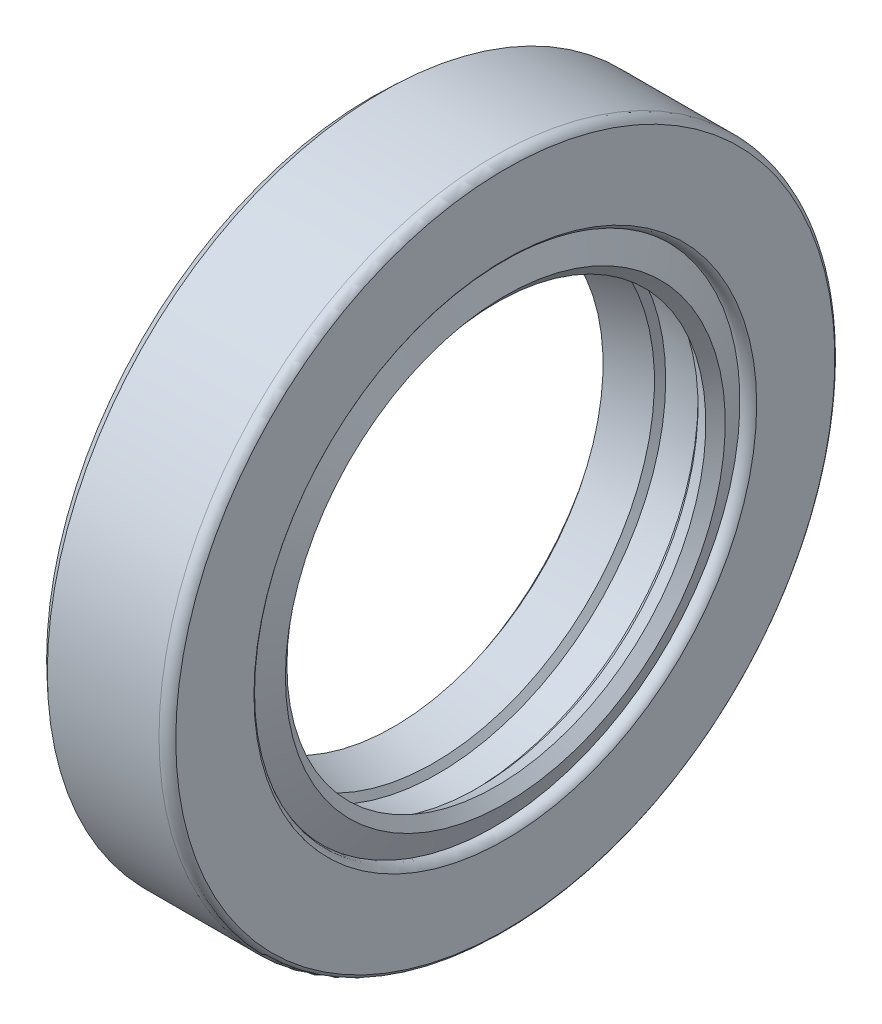
ISO-10303-21;
HEADER;
FILE_DESCRIPTION(('STEP AP214'),'2;1');
FILE_NAME('part.step','',(''),(''),'','','');
FILE_SCHEMA(('AUTOMOTIVE_DESIGN { 1 0 10303 214 1 1 1 1 }'));
ENDSEC;
DATA;
#1=APPLICATION_CONTEXT('core data for automotive mechanical design processes');
#2=APPLICATION_PROTOCOL_DEFINITION('international standard','automotive_design',2000,#1);
#3=PRODUCT_CONTEXT('',#1,'mechanical');
#4=PRODUCT('Part','Part','',(#3));
#5=PRODUCT_RELATED_PRODUCT_CATEGORY('part','',(#4));
#6=PRODUCT_DEFINITION_FORMATION('','',#4);
#7=PRODUCT_DEFINITION_CONTEXT('part definition',#1,'design');
#8=PRODUCT_DEFINITION('design','',#6,#7);
#9=PRODUCT_DEFINITION_SHAPE('','',#8);
#10=(LENGTH_UNIT() NAMED_UNIT(*) SI_UNIT(.MILLI.,.METRE.));
#11=(NAMED_UNIT(*) PLANE_ANGLE_UNIT() SI_UNIT($,.RADIAN.));
#12=(NAMED_UNIT(*) SI_UNIT($,.STERADIAN.) SOLID_ANGLE_UNIT());
#13=UNCERTAINTY_MEASURE_WITH_UNIT(LENGTH_MEASURE(1.E-05),#10,'distance_accuracy_value','');
#14=(GEOMETRIC_REPRESENTATION_CONTEXT(3) GLOBAL_UNCERTAINTY_ASSIGNED_CONTEXT((#13)) GLOBAL_UNIT_ASSIGNED_CONTEXT((#10,
#11,#12)) REPRESENTATION_CONTEXT('',''));
#15=CARTESIAN_POINT('',(0.,0.,0.));
#16=DIRECTION('',(0.,0.,1.));
#17=DIRECTION('',(1.,0.,0.));
#18=AXIS2_PLACEMENT_3D('',#15,#16,#17);
#19=CARTESIAN_POINT('',(0.,0.,0.));
#20=DIRECTION('',(-1.,0.,0.));
#21=DIRECTION('',(0.,0.,1.));
#22=AXIS2_PLACEMENT_3D('',#19,#20,#21);
#23=CYLINDRICAL_SURFACE('',#22,20.);
#24=CARTESIAN_POINT('',(7.33333333333333,0.,0.));
#25=DIRECTION('',(-1.,0.,0.));
#26=DIRECTION('',(0.,0.,1.));
#27=AXIS2_PLACEMENT_3D('',#24,#25,#26);
#28=CIRCLE('',#27,20.);
#29=CARTESIAN_POINT('',(7.33333333333333,0.,20.));
#30=VERTEX_POINT('',#29);
#31=EDGE_CURVE('E9',#30,#30,#28,.T.);
#32=ORIENTED_EDGE('',*,*,#31,.T.);
#33=EDGE_LOOP('',(#32));
#34=FACE_BOUND('',#33,.T.);
#35=CARTESIAN_POINT('',(0.666666666666667,0.,0.));
#36=DIRECTION('',(-1.,0.,0.));
#37=DIRECTION('',(0.,0.,1.));
#38=AXIS2_PLACEMENT_3D('',#35,#36,#37);
#39=CIRCLE('',#38,20.);
#40=CARTESIAN_POINT('',(0.666666666666667,0.,20.));
#41=VERTEX_POINT('',#40);
#42=EDGE_CURVE('E81',#41,#41,#39,.T.);
#43=ORIENTED_EDGE('',*,*,#42,.F.);
#44=EDGE_LOOP('',(#43));
#45=FACE_BOUND('',#44,.T.);
#46=ADVANCED_FACE('F14',(#34,#45),#23,.T.);
#47=CARTESIAN_POINT('',(7.41946005043015,0.,0.));
#48=DIRECTION('',(-1.,0.,0.));
#49=DIRECTION('',(0.,0.,1.));
#50=AXIS2_PLACEMENT_3D('',#47,#48,#49);
#51=TOROIDAL_SURFACE('',#50,19.3389201008603,0.666666666666667);
#52=ORIENTED_EDGE('',*,*,#31,.F.);
#53=EDGE_LOOP('',(#52));
#54=FACE_BOUND('',#53,.T.);
#55=CARTESIAN_POINT('',(8.,0.,0.));
#56=DIRECTION('',(-1.,0.,0.));
#57=DIRECTION('',(0.,0.,1.));
#58=AXIS2_PLACEMENT_3D('',#55,#56,#57);
#59=CIRCLE('',#58,19.6666666666666);
#60=CARTESIAN_POINT('',(8.,0.,19.6666666666666));
#61=VERTEX_POINT('',#60);
#62=EDGE_CURVE('E20',#61,#61,#59,.T.);
#63=ORIENTED_EDGE('',*,*,#62,.T.);
#64=EDGE_LOOP('',(#63));
#65=FACE_BOUND('',#64,.T.);
#66=ADVANCED_FACE('F89',(#54,#65),#51,.T.);
#67=CARTESIAN_POINT('',(8.,19.6666666666666,0.));
#68=DIRECTION('',(1.,0.,0.));
#69=DIRECTION('',(0.,0.,-1.));
#70=AXIS2_PLACEMENT_3D('',#67,#68,#69);
#71=PLANE('',#70);
#72=CARTESIAN_POINT('',(8.,0.,0.));
#73=DIRECTION('',(-1.,0.,0.));
#74=DIRECTION('',(0.,0.,1.));
#75=AXIS2_PLACEMENT_3D('',#72,#73,#74);
#76=CIRCLE('',#75,15.);
#77=CARTESIAN_POINT('',(8.,0.,15.));
#78=VERTEX_POINT('',#77);
#79=EDGE_CURVE('E24',#78,#78,#76,.T.);
#80=ORIENTED_EDGE('',*,*,#79,.T.);
#81=EDGE_LOOP('',(#80));
#82=FACE_BOUND('',#81,.T.);
#83=ORIENTED_EDGE('',*,*,#62,.F.);
#84=EDGE_LOOP('',(#83));
#85=FACE_BOUND('',#84,.T.);
#86=ADVANCED_FACE('F94',(#82,#85),#71,.T.);
#87=CARTESIAN_POINT('',(7.41946005043015,0.,0.));
#88=DIRECTION('',(-1.,0.,0.));
#89=DIRECTION('',(0.,0.,1.));
#90=AXIS2_PLACEMENT_3D('',#87,#88,#89);
#91=TOROIDAL_SURFACE('',#90,15.3277465658064,0.666666666666667);
#92=ORIENTED_EDGE('',*,*,#79,.F.);
#93=EDGE_LOOP('',(#92));
#94=FACE_BOUND('',#93,.T.);
#95=CARTESIAN_POINT('',(7.33333333333333,0.,0.));
#96=DIRECTION('',(-1.,0.,0.));
#97=DIRECTION('',(0.,0.,1.));
#98=AXIS2_PLACEMENT_3D('',#95,#96,#97);
#99=CIRCLE('',#98,14.6666666666667);
#100=CARTESIAN_POINT('',(7.33333333333333,0.,14.6666666666667));
#101=VERTEX_POINT('',#100);
#102=EDGE_CURVE('E28',#101,#101,#99,.T.);
#103=ORIENTED_EDGE('',*,*,#102,.T.);
#104=EDGE_LOOP('',(#103));
#105=FACE_BOUND('',#104,.T.);
#106=ADVANCED_FACE('F99',(#94,#105),#91,.T.);
#107=CARTESIAN_POINT('',(8.,0.,0.));
#108=DIRECTION('',(-1.,0.,0.));
#109=DIRECTION('',(0.,0.,1.));
#110=AXIS2_PLACEMENT_3D('',#107,#108,#109);
#111=CONICAL_SURFACE('',#110,13.125,1.16264722303981);
#112=ORIENTED_EDGE('',*,*,#102,.F.);
#113=EDGE_LOOP('',(#112));
#114=FACE_BOUND('',#113,.T.);
#115=CARTESIAN_POINT('',(8.,0.,0.));
#116=DIRECTION('',(-1.,0.,0.));
#117=DIRECTION('',(0.,0.,1.));
#118=AXIS2_PLACEMENT_3D('',#115,#116,#117);
#119=CIRCLE('',#118,13.125);
#120=CARTESIAN_POINT('',(8.,0.,13.125));
#121=VERTEX_POINT('',#120);
#122=EDGE_CURVE('E33',#121,#121,#119,.T.);
#123=ORIENTED_EDGE('',*,*,#122,.T.);
#124=EDGE_LOOP('',(#123));
#125=FACE_BOUND('',#124,.T.);
#126=ADVANCED_FACE('F105',(#114,#125),#111,.T.);
#127=CARTESIAN_POINT('',(7.46666666666667,0.,0.));
#128=DIRECTION('',(1.,0.,0.));
#129=DIRECTION('',(0.,0.,-1.));
#130=AXIS2_PLACEMENT_3D('',#127,#128,#129);
#131=CONICAL_SURFACE('',#130,12.5,0.86437027113884);
#132=ORIENTED_EDGE('',*,*,#122,.F.);
#133=EDGE_LOOP('',(#132));
#134=FACE_BOUND('',#133,.T.);
#135=CARTESIAN_POINT('',(7.46666666666667,0.,0.));
#136=DIRECTION('',(-1.,0.,0.));
#137=DIRECTION('',(0.,0.,1.));
#138=AXIS2_PLACEMENT_3D('',#135,#136,#137);
#139=CIRCLE('',#138,12.5);
#140=CARTESIAN_POINT('',(7.46666666666667,0.,12.5));
#141=VERTEX_POINT('',#140);
#142=EDGE_CURVE('E36',#141,#141,#139,.T.);
#143=ORIENTED_EDGE('',*,*,#142,.T.);
#144=EDGE_LOOP('',(#143));
#145=FACE_BOUND('',#144,.T.);
#146=ADVANCED_FACE('F109',(#134,#145),#131,.F.);
#147=CARTESIAN_POINT('',(6.33333333333333,0.,0.));
#148=DIRECTION('',(-1.,0.,0.));
#149=DIRECTION('',(0.,0.,1.));
#150=AXIS2_PLACEMENT_3D('',#147,#148,#149);
#151=CONICAL_SURFACE('',#150,13.1666666666667,0.531724067258805);
#152=ORIENTED_EDGE('',*,*,#142,.F.);
#153=EDGE_LOOP('',(#152));
#154=FACE_BOUND('',#153,.T.);
#155=CARTESIAN_POINT('',(6.33333333333333,0.,0.));
#156=DIRECTION('',(-1.,0.,0.));
#157=DIRECTION('',(0.,0.,1.));
#158=AXIS2_PLACEMENT_3D('',#155,#156,#157);
#159=CIRCLE('',#158,13.1666666666667);
#160=CARTESIAN_POINT('',(6.33333333333333,0.,13.1666666666667));
#161=VERTEX_POINT('',#160);
#162=EDGE_CURVE('E39',#161,#161,#159,.T.);
#163=ORIENTED_EDGE('',*,*,#162,.T.);
#164=EDGE_LOOP('',(#163));
#165=FACE_BOUND('',#164,.T.);
#166=ADVANCED_FACE('F113',(#154,#165),#151,.F.);
#167=CARTESIAN_POINT('',(5.72570811482257,0.,0.));
#168=DIRECTION('',(-1.,0.,0.));
#169=DIRECTION('',(0.,0.,1.));
#170=AXIS2_PLACEMENT_3D('',#167,#168,#169);
#171=TOROIDAL_SURFACE('',#170,12.8923747814892,0.666666666666667);
#172=CARTESIAN_POINT('',(6.,0.,0.));
#173=DIRECTION('',(-1.,0.,0.));
#174=DIRECTION('',(0.,0.,1.));
#175=AXIS2_PLACEMENT_3D('',#172,#173,#174);
#176=CIRCLE('',#175,13.5);
#177=CARTESIAN_POINT('',(6.,0.,13.5));
#178=VERTEX_POINT('',#177);
#179=EDGE_CURVE('E42',#178,#178,#176,.T.);
#180=ORIENTED_EDGE('',*,*,#179,.T.);
#181=EDGE_LOOP('',(#180));
#182=FACE_BOUND('',#181,.T.);
#183=ORIENTED_EDGE('',*,*,#162,.F.);
#184=EDGE_LOOP('',(#183));
#185=FACE_BOUND('',#184,.T.);
#186=ADVANCED_FACE('F117',(#182,#185),#171,.F.);
#187=CARTESIAN_POINT('',(4.,0.,0.));
#188=DIRECTION('',(-1.,0.,0.));
#189=DIRECTION('',(0.,0.,1.));
#190=AXIS2_PLACEMENT_3D('',#187,#188,#189);
#191=CONICAL_SURFACE('',#190,13.5714285714286,0.0356991126793238);
#192=ORIENTED_EDGE('',*,*,#179,.F.);
#193=EDGE_LOOP('',(#192));
#194=FACE_BOUND('',#193,.T.);
#195=CARTESIAN_POINT('',(4.,0.,0.));
#196=DIRECTION('',(-1.,0.,0.));
#197=DIRECTION('',(0.,0.,1.));
#198=AXIS2_PLACEMENT_3D('',#195,#196,#197);
#199=CIRCLE('',#198,13.5714285714286);
#200=CARTESIAN_POINT('',(4.,0.,13.5714285714286));
#201=VERTEX_POINT('',#200);
#202=EDGE_CURVE('E45',#201,#201,#199,.T.);
#203=ORIENTED_EDGE('',*,*,#202,.T.);
#204=EDGE_LOOP('',(#203));
#205=FACE_BOUND('',#204,.T.);
#206=ADVANCED_FACE('F121',(#194,#205),#191,.F.);
#207=CARTESIAN_POINT('',(4.,0.,0.));
#208=DIRECTION('',(1.,0.,0.));
#209=DIRECTION('',(0.,0.,-1.));
#210=AXIS2_PLACEMENT_3D('',#207,#208,#209);
#211=CONICAL_SURFACE('',#210,13.5714285714286,0.988243260581542);
#212=CARTESIAN_POINT('',(3.73333333333334,0.,0.));
#213=DIRECTION('',(-1.,0.,0.));
#214=DIRECTION('',(0.,0.,1.));
#215=AXIS2_PLACEMENT_3D('',#212,#213,#214);
#216=CIRCLE('',#215,13.1666666666667);
#217=CARTESIAN_POINT('',(3.73333333333334,0.,13.1666666666667));
#218=VERTEX_POINT('',#217);
#219=EDGE_CURVE('E48',#218,#218,#216,.T.);
#220=ORIENTED_EDGE('',*,*,#219,.T.);
#221=EDGE_LOOP('',(#220));
#222=FACE_BOUND('',#221,.T.);
#223=ORIENTED_EDGE('',*,*,#202,.F.);
#224=EDGE_LOOP('',(#223));
#225=FACE_BOUND('',#224,.T.);
#226=ADVANCED_FACE('F125',(#222,#225),#211,.F.);
#227=CARTESIAN_POINT('',(3.73333333333334,0.,0.));
#228=DIRECTION('',(1.,0.,0.));
#229=DIRECTION('',(0.,0.,-1.));
#230=AXIS2_PLACEMENT_3D('',#227,#228,#229);
#231=CONICAL_SURFACE('',#230,13.1666666666667,0.27094685033842);
#232=CARTESIAN_POINT('',(1.33333333333333,0.,0.));
#233=DIRECTION('',(-1.,0.,0.));
#234=DIRECTION('',(0.,0.,1.));
#235=AXIS2_PLACEMENT_3D('',#232,#233,#234);
#236=CIRCLE('',#235,12.5);
#237=CARTESIAN_POINT('',(1.33333333333333,0.,12.5));
#238=VERTEX_POINT('',#237);
#239=EDGE_CURVE('E51',#238,#238,#236,.T.);
#240=ORIENTED_EDGE('',*,*,#239,.T.);
#241=EDGE_LOOP('',(#240));
#242=FACE_BOUND('',#241,.T.);
#243=ORIENTED_EDGE('',*,*,#219,.F.);
#244=EDGE_LOOP('',(#243));
#245=FACE_BOUND('',#244,.T.);
#246=ADVANCED_FACE('F129',(#242,#245),#231,.F.);
#247=CARTESIAN_POINT('',(1.33333333333333,0.,0.));
#248=DIRECTION('',(-1.,0.,0.));
#249=DIRECTION('',(0.,0.,1.));
#250=AXIS2_PLACEMENT_3D('',#247,#248,#249);
#251=CONICAL_SURFACE('',#250,12.5,0.929431966886443);
#252=CARTESIAN_POINT('',(0.533333333333334,0.,0.));
#253=DIRECTION('',(-1.,0.,0.));
#254=DIRECTION('',(0.,0.,1.));
#255=AXIS2_PLACEMENT_3D('',#252,#253,#254);
#256=CIRCLE('',#255,13.5714285714286);
#257=CARTESIAN_POINT('',(0.533333333333334,0.,13.5714285714286));
#258=VERTEX_POINT('',#257);
#259=EDGE_CURVE('E54',#258,#258,#256,.T.);
#260=ORIENTED_EDGE('',*,*,#259,.T.);
#261=EDGE_LOOP('',(#260));
#262=FACE_BOUND('',#261,.T.);
#263=ORIENTED_EDGE('',*,*,#239,.F.);
#264=EDGE_LOOP('',(#263));
#265=FACE_BOUND('',#264,.T.);
#266=ADVANCED_FACE('F133',(#262,#265),#251,.F.);
#267=CARTESIAN_POINT('',(0.533333333333333,13.5714285714286,0.));
#268=DIRECTION('',(-1.,0.,0.));
#269=DIRECTION('',(0.,0.,1.));
#270=AXIS2_PLACEMENT_3D('',#267,#268,#269);
#271=PLANE('',#270);
#272=CARTESIAN_POINT('',(0.533333333333334,0.,0.));
#273=DIRECTION('',(-1.,0.,0.));
#274=DIRECTION('',(0.,0.,1.));
#275=AXIS2_PLACEMENT_3D('',#272,#273,#274);
#276=CIRCLE('',#275,15.2464212528966);
#277=CARTESIAN_POINT('',(0.533333333333334,0.,15.2464212528966));
#278=VERTEX_POINT('',#277);
#279=EDGE_CURVE('E57',#278,#278,#276,.T.);
#280=ORIENTED_EDGE('',*,*,#279,.T.);
#281=EDGE_LOOP('',(#280));
#282=FACE_BOUND('',#281,.T.);
#283=ORIENTED_EDGE('',*,*,#259,.F.);
#284=EDGE_LOOP('',(#283));
#285=FACE_BOUND('',#284,.T.);
#286=ADVANCED_FACE('F137',(#282,#285),#271,.T.);
#287=CARTESIAN_POINT('',(0.,0.,0.));
#288=DIRECTION('',(-1.,0.,0.));
#289=DIRECTION('',(0.,0.,1.));
#290=AXIS2_PLACEMENT_3D('',#287,#288,#289);
#291=CYLINDRICAL_SURFACE('',#290,15.2464212528966);
#292=CARTESIAN_POINT('',(1.57795142459664,0.,0.));
#293=DIRECTION('',(-1.,0.,0.));
#294=DIRECTION('',(0.,0.,1.));
#295=AXIS2_PLACEMENT_3D('',#292,#293,#294);
#296=CIRCLE('',#295,15.2464212528966);
#297=CARTESIAN_POINT('',(1.57795142459664,0.,15.2464212528966));
#298=VERTEX_POINT('',#297);
#299=EDGE_CURVE('E60',#298,#298,#296,.T.);
#300=ORIENTED_EDGE('',*,*,#299,.T.);
#301=EDGE_LOOP('',(#300));
#302=FACE_BOUND('',#301,.T.);
#303=ORIENTED_EDGE('',*,*,#279,.F.);
#304=EDGE_LOOP('',(#303));
#305=FACE_BOUND('',#304,.T.);
#306=ADVANCED_FACE('F141',(#302,#305),#291,.T.);
#307=CARTESIAN_POINT('',(2.,0.,0.));
#308=DIRECTION('',(-1.,0.,0.));
#309=DIRECTION('',(0.,0.,1.));
#310=AXIS2_PLACEMENT_3D('',#307,#308,#309);
#311=TOROIDAL_SURFACE('',#310,14.375,0.968245836551854);
#312=ORIENTED_EDGE('',*,*,#299,.F.);
#313=EDGE_LOOP('',(#312));
#314=FACE_BOUND('',#313,.T.);
#315=CARTESIAN_POINT('',(2.9449901071866,0.,0.));
#316=DIRECTION('',(-1.,0.,0.));
#317=DIRECTION('',(0.,0.,1.));
#318=AXIS2_PLACEMENT_3D('',#315,#316,#317);
#319=CIRCLE('',#318,14.5859352917827);
#320=CARTESIAN_POINT('',(2.9449901071866,0.,14.5859352917827));
#321=VERTEX_POINT('',#320);
#322=EDGE_CURVE('E63',#321,#321,#319,.T.);
#323=ORIENTED_EDGE('',*,*,#322,.T.);
#324=EDGE_LOOP('',(#323));
#325=FACE_BOUND('',#324,.T.);
#326=ADVANCED_FACE('F145',(#314,#325),#311,.T.);
#327=CARTESIAN_POINT('',(4.8,0.,0.));
#328=DIRECTION('',(1.,0.,0.));
#329=DIRECTION('',(0.,0.,-1.));
#330=AXIS2_PLACEMENT_3D('',#327,#328,#329);
#331=CONICAL_SURFACE('',#330,15.,0.2196141251766);
#332=ORIENTED_EDGE('',*,*,#322,.F.);
#333=EDGE_LOOP('',(#332));
#334=FACE_BOUND('',#333,.T.);
#335=CARTESIAN_POINT('',(4.8,0.,0.));
#336=DIRECTION('',(-1.,0.,0.));
#337=DIRECTION('',(0.,0.,1.));
#338=AXIS2_PLACEMENT_3D('',#335,#336,#337);
#339=CIRCLE('',#338,15.);
#340=CARTESIAN_POINT('',(4.8,0.,15.));
#341=VERTEX_POINT('',#340);
#342=EDGE_CURVE('E66',#341,#341,#339,.T.);
#343=ORIENTED_EDGE('',*,*,#342,.T.);
#344=EDGE_LOOP('',(#343));
#345=FACE_BOUND('',#344,.T.);
#346=ADVANCED_FACE('F149',(#334,#345),#331,.T.);
#347=CARTESIAN_POINT('',(4.8,17.7916666666667,0.));
#348=DIRECTION('',(1.,0.,0.));
#349=DIRECTION('',(0.,0.,-1.));
#350=AXIS2_PLACEMENT_3D('',#347,#348,#349);
#351=PLANE('',#350);
#352=ORIENTED_EDGE('',*,*,#342,.F.);
#353=EDGE_LOOP('',(#352));
#354=FACE_BOUND('',#353,.T.);
#355=CARTESIAN_POINT('',(4.8,0.,0.));
#356=DIRECTION('',(-1.,0.,0.));
#357=DIRECTION('',(0.,0.,1.));
#358=AXIS2_PLACEMENT_3D('',#355,#356,#357);
#359=CIRCLE('',#358,17.7916666666667);
#360=CARTESIAN_POINT('',(4.8,0.,17.7916666666667));
#361=VERTEX_POINT('',#360);
#362=EDGE_CURVE('E69',#361,#361,#359,.T.);
#363=ORIENTED_EDGE('',*,*,#362,.T.);
#364=EDGE_LOOP('',(#363));
#365=FACE_BOUND('',#364,.T.);
#366=ADVANCED_FACE('F153',(#354,#365),#351,.F.);
#367=CARTESIAN_POINT('',(4.19237478148924,0.,0.));
#368=DIRECTION('',(-1.,0.,0.));
#369=DIRECTION('',(0.,0.,1.));
#370=AXIS2_PLACEMENT_3D('',#367,#368,#369);
#371=TOROIDAL_SURFACE('',#370,17.5173747814893,0.666666666666667);
#372=CARTESIAN_POINT('',(4.46666666666667,0.,0.));
#373=DIRECTION('',(-1.,0.,0.));
#374=DIRECTION('',(0.,0.,1.));
#375=AXIS2_PLACEMENT_3D('',#372,#373,#374);
#376=CIRCLE('',#375,18.125);
#377=CARTESIAN_POINT('',(4.46666666666667,0.,18.125));
#378=VERTEX_POINT('',#377);
#379=EDGE_CURVE('E72',#378,#378,#376,.T.);
#380=ORIENTED_EDGE('',*,*,#379,.T.);
#381=EDGE_LOOP('',(#380));
#382=FACE_BOUND('',#381,.T.);
#383=ORIENTED_EDGE('',*,*,#362,.F.);
#384=EDGE_LOOP('',(#383));
#385=FACE_BOUND('',#384,.T.);
#386=ADVANCED_FACE('F157',(#382,#385),#371,.F.);
#387=CARTESIAN_POINT('',(0.,0.,0.));
#388=DIRECTION('',(-1.,0.,0.));
#389=DIRECTION('',(0.,0.,1.));
#390=AXIS2_PLACEMENT_3D('',#387,#388,#389);
#391=CONICAL_SURFACE('',#390,18.5,0.0837588016725198);
#392=ORIENTED_EDGE('',*,*,#379,.F.);
#393=EDGE_LOOP('',(#392));
#394=FACE_BOUND('',#393,.T.);
#395=CARTESIAN_POINT('',(0.,0.,0.));
#396=DIRECTION('',(-1.,0.,0.));
#397=DIRECTION('',(0.,0.,1.));
#398=AXIS2_PLACEMENT_3D('',#395,#396,#397);
#399=CIRCLE('',#398,18.5);
#400=CARTESIAN_POINT('',(0.,0.,18.5));
#401=VERTEX_POINT('',#400);
#402=EDGE_CURVE('E75',#401,#401,#399,.T.);
#403=ORIENTED_EDGE('',*,*,#402,.T.);
#404=EDGE_LOOP('',(#403));
#405=FACE_BOUND('',#404,.T.);
#406=ADVANCED_FACE('F161',(#394,#405),#391,.F.);
#407=CARTESIAN_POINT('',(0.,18.5,0.));
#408=DIRECTION('',(-1.,0.,0.));
#409=DIRECTION('',(0.,0.,1.));
#410=AXIS2_PLACEMENT_3D('',#407,#408,#409);
#411=PLANE('',#410);
#412=CARTESIAN_POINT('',(0.,0.,0.));
#413=DIRECTION('',(-1.,0.,0.));
#414=DIRECTION('',(0.,0.,1.));
#415=AXIS2_PLACEMENT_3D('',#412,#413,#414);
#416=CIRCLE('',#415,19.375);
#417=CARTESIAN_POINT('',(0.,0.,19.375));
#418=VERTEX_POINT('',#417);
#419=EDGE_CURVE('E78',#418,#418,#416,.T.);
#420=ORIENTED_EDGE('',*,*,#419,.T.);
#421=EDGE_LOOP('',(#420));
#422=FACE_BOUND('',#421,.T.);
#423=ORIENTED_EDGE('',*,*,#402,.F.);
#424=EDGE_LOOP('',(#423));
#425=FACE_BOUND('',#424,.T.);
#426=ADVANCED_FACE('F165',(#422,#425),#411,.T.);
#427=CARTESIAN_POINT('',(0.,0.,0.));
#428=DIRECTION('',(1.,0.,0.));
#429=DIRECTION('',(0.,0.,-1.));
#430=AXIS2_PLACEMENT_3D('',#427,#428,#429);
#431=CONICAL_SURFACE('',#430,19.375,0.753151280962195);
#432=ORIENTED_EDGE('',*,*,#42,.T.);
#433=EDGE_LOOP('',(#432));
#434=FACE_BOUND('',#433,.T.);
#435=ORIENTED_EDGE('',*,*,#419,.F.);
#436=EDGE_LOOP('',(#435));
#437=FACE_BOUND('',#436,.T.);
#438=ADVANCED_FACE('F85',(#434,#437),#431,.T.);
#439=CLOSED_SHELL('',(#46,#66,#86,#106,#126,#146,#166,#186,#206,#226,#246,#266,#286,#306,#326,
#346,#366,#386,#406,#426,#438));
#440=MANIFOLD_SOLID_BREP('B1',#439);
#441=ADVANCED_BREP_SHAPE_REPRESENTATION('',(#18,#440),#14);
#442=SHAPE_DEFINITION_REPRESENTATION(#9,#441);
ENDSEC;
END-ISO-10303-21;
